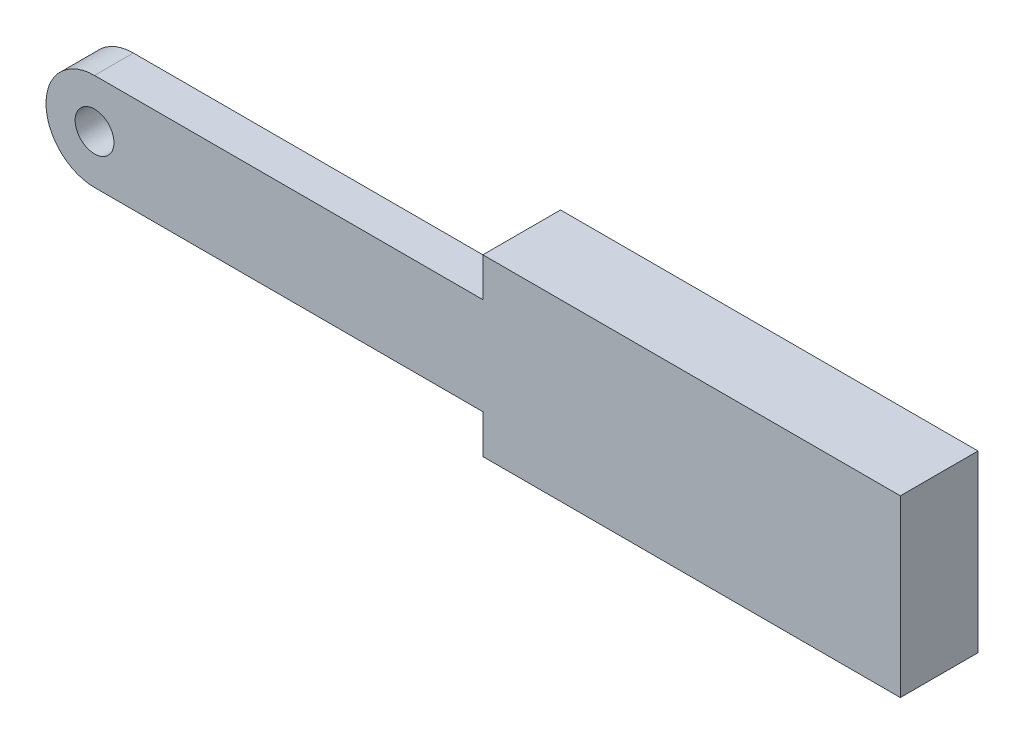
ISO-10303-21;
HEADER;
FILE_DESCRIPTION(('STEP AP214'),'2;1');
FILE_NAME('part.step','',(''),(''),'','','');
FILE_SCHEMA(('AUTOMOTIVE_DESIGN { 1 0 10303 214 1 1 1 1 }'));
ENDSEC;
DATA;
#1=APPLICATION_CONTEXT('core data for automotive mechanical design processes');
#2=APPLICATION_PROTOCOL_DEFINITION('international standard','automotive_design',2000,#1);
#3=PRODUCT_CONTEXT('',#1,'mechanical');
#4=PRODUCT('Part','Part','',(#3));
#5=PRODUCT_RELATED_PRODUCT_CATEGORY('part','',(#4));
#6=PRODUCT_DEFINITION_FORMATION('','',#4);
#7=PRODUCT_DEFINITION_CONTEXT('part definition',#1,'design');
#8=PRODUCT_DEFINITION('design','',#6,#7);
#9=PRODUCT_DEFINITION_SHAPE('','',#8);
#10=(LENGTH_UNIT() NAMED_UNIT(*) SI_UNIT(.MILLI.,.METRE.));
#11=(NAMED_UNIT(*) PLANE_ANGLE_UNIT() SI_UNIT($,.RADIAN.));
#12=(NAMED_UNIT(*) SI_UNIT($,.STERADIAN.) SOLID_ANGLE_UNIT());
#13=UNCERTAINTY_MEASURE_WITH_UNIT(LENGTH_MEASURE(1.E-05),#10,'distance_accuracy_value','');
#14=(GEOMETRIC_REPRESENTATION_CONTEXT(3) GLOBAL_UNCERTAINTY_ASSIGNED_CONTEXT((#13)) GLOBAL_UNIT_ASSIGNED_CONTEXT((#10,
#11,#12)) REPRESENTATION_CONTEXT('',''));
#15=CARTESIAN_POINT('',(0.,0.,0.));
#16=DIRECTION('',(0.,0.,1.));
#17=DIRECTION('',(1.,0.,0.));
#18=AXIS2_PLACEMENT_3D('',#15,#16,#17);
#19=CARTESIAN_POINT('',(0.,0.,0.));
#20=DIRECTION('',(0.,0.,1.));
#21=DIRECTION('',(1.,0.,0.));
#22=AXIS2_PLACEMENT_3D('',#19,#20,#21);
#23=PLANE('',#22);
#24=DIRECTION('',(1.,0.,0.));
#25=VECTOR('',#24,1.);
#26=CARTESIAN_POINT('',(0.,-9.,0.));
#27=LINE('',#26,#25);
#28=CARTESIAN_POINT('',(-21.5,-9.,0.));
#29=VERTEX_POINT('',#28);
#30=CARTESIAN_POINT('',(21.5,-9.,0.));
#31=VERTEX_POINT('',#30);
#32=EDGE_CURVE('E253',#29,#31,#27,.T.);
#33=ORIENTED_EDGE('',*,*,#32,.F.);
#34=DIRECTION('',(0.,1.,0.));
#35=VECTOR('',#34,1.);
#36=CARTESIAN_POINT('',(-21.5,0.,0.));
#37=LINE('',#36,#35);
#38=CARTESIAN_POINT('',(-21.5,9.,0.));
#39=VERTEX_POINT('',#38);
#40=EDGE_CURVE('E258',#29,#39,#37,.T.);
#41=ORIENTED_EDGE('',*,*,#40,.T.);
#42=DIRECTION('',(1.,0.,0.));
#43=VECTOR('',#42,1.);
#44=CARTESIAN_POINT('',(0.,9.,0.));
#45=LINE('',#44,#43);
#46=CARTESIAN_POINT('',(21.5,9.,0.));
#47=VERTEX_POINT('',#46);
#48=EDGE_CURVE('E273',#39,#47,#45,.T.);
#49=ORIENTED_EDGE('',*,*,#48,.T.);
#50=DIRECTION('',(0.,1.,0.));
#51=VECTOR('',#50,1.);
#52=CARTESIAN_POINT('',(21.5,0.,0.));
#53=LINE('',#52,#51);
#54=EDGE_CURVE('E270',#31,#47,#53,.T.);
#55=ORIENTED_EDGE('',*,*,#54,.F.);
#56=EDGE_LOOP('',(#33,#41,#49,#55));
#57=FACE_BOUND('',#56,.T.);
#58=CARTESIAN_POINT('',(0.,0.,0.));
#59=DIRECTION('',(0.,0.,1.));
#60=DIRECTION('',(1.,0.,0.));
#61=AXIS2_PLACEMENT_3D('',#58,#59,#60);
#62=CIRCLE('',#61,6.4);
#63=CARTESIAN_POINT('',(-4.51489762889421,-4.53604446633909,0.));
#64=VERTEX_POINT('',#63);
#65=CARTESIAN_POINT('',(4.51489762889421,-4.53604446633909,0.));
#66=VERTEX_POINT('',#65);
#67=EDGE_CURVE('E200',#64,#66,#62,.T.);
#68=ORIENTED_EDGE('',*,*,#67,.T.);
#69=DIRECTION('',(-0.989359135364853,-0.145493990494831,0.));
#70=VECTOR('',#69,1.);
#71=CARTESIAN_POINT('',(0.748518204911092,-5.08992379339543,0.));
#72=LINE('',#71,#70);
#73=CARTESIAN_POINT('',(17.,-2.7,0.));
#74=VERTEX_POINT('',#73);
#75=EDGE_CURVE('E62',#74,#66,#72,.T.);
#76=ORIENTED_EDGE('',*,*,#75,.F.);
#77=CARTESIAN_POINT('',(17.,0.,0.));
#78=DIRECTION('',(0.,0.,1.));
#79=DIRECTION('',(1.,0.,0.));
#80=AXIS2_PLACEMENT_3D('',#77,#78,#79);
#81=CIRCLE('',#80,2.7);
#82=CARTESIAN_POINT('',(17.,2.7,0.));
#83=VERTEX_POINT('',#82);
#84=EDGE_CURVE('E218',#83,#74,#81,.F.);
#85=ORIENTED_EDGE('',*,*,#84,.F.);
#86=DIRECTION('',(-0.989359135364853,0.145493990494831,0.));
#87=VECTOR('',#86,1.);
#88=CARTESIAN_POINT('',(0.748518204911092,5.08992379339543,0.));
#89=LINE('',#88,#87);
#90=CARTESIAN_POINT('',(4.51489762889421,4.53604446633909,0.));
#91=VERTEX_POINT('',#90);
#92=EDGE_CURVE('E221',#83,#91,#89,.T.);
#93=ORIENTED_EDGE('',*,*,#92,.T.);
#94=CARTESIAN_POINT('',(0.,0.,0.));
#95=DIRECTION('',(0.,0.,1.));
#96=DIRECTION('',(1.,0.,0.));
#97=AXIS2_PLACEMENT_3D('',#94,#95,#96);
#98=CIRCLE('',#97,6.4);
#99=CARTESIAN_POINT('',(-4.51489762889421,4.53604446633909,0.));
#100=VERTEX_POINT('',#99);
#101=EDGE_CURVE('E224',#91,#100,#98,.T.);
#102=ORIENTED_EDGE('',*,*,#101,.T.);
#103=DIRECTION('',(0.989359135364853,0.145493990494831,0.));
#104=VECTOR('',#103,1.);
#105=CARTESIAN_POINT('',(-0.748518204911092,5.08992379339543,0.));
#106=LINE('',#105,#104);
#107=CARTESIAN_POINT('',(-17.,2.7,0.));
#108=VERTEX_POINT('',#107);
#109=EDGE_CURVE('E227',#108,#100,#106,.T.);
#110=ORIENTED_EDGE('',*,*,#109,.F.);
#111=CARTESIAN_POINT('',(-17.,0.,0.));
#112=DIRECTION('',(0.,0.,1.));
#113=DIRECTION('',(1.,0.,0.));
#114=AXIS2_PLACEMENT_3D('',#111,#112,#113);
#115=CIRCLE('',#114,2.7);
#116=CARTESIAN_POINT('',(-17.,-2.7,0.));
#117=VERTEX_POINT('',#116);
#118=EDGE_CURVE('E230',#108,#117,#115,.T.);
#119=ORIENTED_EDGE('',*,*,#118,.T.);
#120=DIRECTION('',(0.989359135364853,-0.145493990494831,0.));
#121=VECTOR('',#120,1.);
#122=CARTESIAN_POINT('',(-0.748518204911092,-5.08992379339543,0.));
#123=LINE('',#122,#121);
#124=EDGE_CURVE('E233',#117,#64,#123,.T.);
#125=ORIENTED_EDGE('',*,*,#124,.T.);
#126=EDGE_LOOP('',(#68,#76,#85,#93,#102,#110,#119,#125));
#127=FACE_BOUND('',#126,.T.);
#128=ADVANCED_FACE('F39',(#57,#127),#23,.F.);
#129=CARTESIAN_POINT('',(0.,-9.,8.));
#130=DIRECTION('',(0.,1.,0.));
#131=DIRECTION('',(0.,0.,1.));
#132=AXIS2_PLACEMENT_3D('',#129,#130,#131);
#133=PLANE('',#132);
#134=ORIENTED_EDGE('',*,*,#32,.T.);
#135=DIRECTION('',(0.,0.,-1.));
#136=VECTOR('',#135,1.);
#137=CARTESIAN_POINT('',(21.5,-9.,8.));
#138=LINE('',#137,#136);
#139=CARTESIAN_POINT('',(21.5,-9.,8.));
#140=VERTEX_POINT('',#139);
#141=EDGE_CURVE('E11',#140,#31,#138,.T.);
#142=ORIENTED_EDGE('',*,*,#141,.F.);
#143=DIRECTION('',(1.,0.,0.));
#144=VECTOR('',#143,1.);
#145=CARTESIAN_POINT('',(0.,-9.,8.));
#146=LINE('',#145,#144);
#147=CARTESIAN_POINT('',(-21.5,-9.,8.));
#148=VERTEX_POINT('',#147);
#149=EDGE_CURVE('E254',#148,#140,#146,.T.);
#150=ORIENTED_EDGE('',*,*,#149,.F.);
#151=DIRECTION('',(0.,0.,-1.));
#152=VECTOR('',#151,1.);
#153=CARTESIAN_POINT('',(-21.5,-9.,8.));
#154=LINE('',#153,#152);
#155=EDGE_CURVE('E267',#148,#29,#154,.T.);
#156=ORIENTED_EDGE('',*,*,#155,.T.);
#157=EDGE_LOOP('',(#134,#142,#150,#156));
#158=FACE_BOUND('',#157,.T.);
#159=ADVANCED_FACE('F41',(#158),#133,.F.);
#160=CARTESIAN_POINT('',(21.5,0.,8.));
#161=DIRECTION('',(-1.,0.,0.));
#162=DIRECTION('',(0.,0.,1.));
#163=AXIS2_PLACEMENT_3D('',#160,#161,#162);
#164=PLANE('',#163);
#165=ORIENTED_EDGE('',*,*,#54,.T.);
#166=DIRECTION('',(0.,0.,-1.));
#167=VECTOR('',#166,1.);
#168=CARTESIAN_POINT('',(21.5,9.,8.));
#169=LINE('',#168,#167);
#170=CARTESIAN_POINT('',(21.5,9.,8.));
#171=VERTEX_POINT('',#170);
#172=EDGE_CURVE('E47',#171,#47,#169,.T.);
#173=ORIENTED_EDGE('',*,*,#172,.F.);
#174=DIRECTION('',(0.,1.,0.));
#175=VECTOR('',#174,1.);
#176=CARTESIAN_POINT('',(21.5,0.,8.));
#177=LINE('',#176,#175);
#178=EDGE_CURVE('E257',#140,#171,#177,.T.);
#179=ORIENTED_EDGE('',*,*,#178,.F.);
#180=ORIENTED_EDGE('',*,*,#141,.T.);
#181=EDGE_LOOP('',(#165,#173,#179,#180));
#182=FACE_BOUND('',#181,.T.);
#183=ADVANCED_FACE('F287',(#182),#164,.F.);
#184=CARTESIAN_POINT('',(0.,9.,8.));
#185=DIRECTION('',(0.,1.,0.));
#186=DIRECTION('',(0.,0.,1.));
#187=AXIS2_PLACEMENT_3D('',#184,#185,#186);
#188=PLANE('',#187);
#189=ORIENTED_EDGE('',*,*,#48,.F.);
#190=DIRECTION('',(0.,0.,-1.));
#191=VECTOR('',#190,1.);
#192=CARTESIAN_POINT('',(-21.5,9.,8.));
#193=LINE('',#192,#191);
#194=CARTESIAN_POINT('',(-21.5,9.,8.));
#195=VERTEX_POINT('',#194);
#196=EDGE_CURVE('E279',#195,#39,#193,.T.);
#197=ORIENTED_EDGE('',*,*,#196,.F.);
#198=DIRECTION('',(1.,0.,0.));
#199=VECTOR('',#198,1.);
#200=CARTESIAN_POINT('',(0.,9.,8.));
#201=LINE('',#200,#199);
#202=EDGE_CURVE('E260',#195,#171,#201,.T.);
#203=ORIENTED_EDGE('',*,*,#202,.T.);
#204=ORIENTED_EDGE('',*,*,#172,.T.);
#205=EDGE_LOOP('',(#189,#197,#203,#204));
#206=FACE_BOUND('',#205,.T.);
#207=ADVANCED_FACE('F283',(#206),#188,.T.);
#208=CARTESIAN_POINT('',(-21.5,0.,8.));
#209=DIRECTION('',(-1.,0.,0.));
#210=DIRECTION('',(0.,0.,1.));
#211=AXIS2_PLACEMENT_3D('',#208,#209,#210);
#212=PLANE('',#211);
#213=DIRECTION('',(0.,0.,1.));
#214=VECTOR('',#213,1.);
#215=CARTESIAN_POINT('',(-21.5,-5.,4.));
#216=LINE('',#215,#214);
#217=CARTESIAN_POINT('',(-21.5,-5.,4.));
#218=VERTEX_POINT('',#217);
#219=CARTESIAN_POINT('',(-21.5,-5.,8.));
#220=VERTEX_POINT('',#219);
#221=EDGE_CURVE('E173',#218,#220,#216,.T.);
#222=ORIENTED_EDGE('',*,*,#221,.F.);
#223=DIRECTION('',(0.,-1.,0.));
#224=VECTOR('',#223,1.);
#225=CARTESIAN_POINT('',(-21.5,0.,4.));
#226=LINE('',#225,#224);
#227=CARTESIAN_POINT('',(-21.5,5.,4.));
#228=VERTEX_POINT('',#227);
#229=EDGE_CURVE('E161',#228,#218,#226,.T.);
#230=ORIENTED_EDGE('',*,*,#229,.F.);
#231=DIRECTION('',(0.,0.,1.));
#232=VECTOR('',#231,1.);
#233=CARTESIAN_POINT('',(-21.5,5.,4.));
#234=LINE('',#233,#232);
#235=CARTESIAN_POINT('',(-21.5,5.,8.));
#236=VERTEX_POINT('',#235);
#237=EDGE_CURVE('E193',#228,#236,#234,.T.);
#238=ORIENTED_EDGE('',*,*,#237,.T.);
#239=DIRECTION('',(0.,1.,0.));
#240=VECTOR('',#239,1.);
#241=CARTESIAN_POINT('',(-21.5,0.,8.));
#242=LINE('',#241,#240);
#243=EDGE_CURVE('E263',#236,#195,#242,.T.);
#244=ORIENTED_EDGE('',*,*,#243,.T.);
#245=ORIENTED_EDGE('',*,*,#196,.T.);
#246=ORIENTED_EDGE('',*,*,#40,.F.);
#247=ORIENTED_EDGE('',*,*,#155,.F.);
#248=EDGE_CURVE('E264',#148,#220,#242,.T.);
#249=ORIENTED_EDGE('',*,*,#248,.T.);
#250=EDGE_LOOP('',(#222,#230,#238,#244,#245,#246,#247,#249));
#251=FACE_BOUND('',#250,.T.);
#252=ADVANCED_FACE('F294',(#251),#212,.T.);
#253=CARTESIAN_POINT('',(0.,0.,8.));
#254=DIRECTION('',(0.,0.,1.));
#255=DIRECTION('',(1.,0.,0.));
#256=AXIS2_PLACEMENT_3D('',#253,#254,#255);
#257=PLANE('',#256);
#258=ORIENTED_EDGE('',*,*,#149,.T.);
#259=ORIENTED_EDGE('',*,*,#178,.T.);
#260=ORIENTED_EDGE('',*,*,#202,.F.);
#261=ORIENTED_EDGE('',*,*,#243,.F.);
#262=DIRECTION('',(-1.,0.,0.));
#263=VECTOR('',#262,1.);
#264=CARTESIAN_POINT('',(0.,5.,8.));
#265=LINE('',#264,#263);
#266=CARTESIAN_POINT('',(-61.5,5.,8.));
#267=VERTEX_POINT('',#266);
#268=EDGE_CURVE('E54',#236,#267,#265,.T.);
#269=ORIENTED_EDGE('',*,*,#268,.T.);
#270=CARTESIAN_POINT('',(-61.5,0.,8.));
#271=DIRECTION('',(0.,0.,1.));
#272=DIRECTION('',(1.,0.,0.));
#273=AXIS2_PLACEMENT_3D('',#270,#271,#272);
#274=CIRCLE('',#273,5.);
#275=CARTESIAN_POINT('',(-61.5,-5.00000000000001,8.));
#276=VERTEX_POINT('',#275);
#277=EDGE_CURVE('E188',#267,#276,#274,.T.);
#278=ORIENTED_EDGE('',*,*,#277,.T.);
#279=DIRECTION('',(-1.,0.,0.));
#280=VECTOR('',#279,1.);
#281=CARTESIAN_POINT('',(0.,-5.,8.));
#282=LINE('',#281,#280);
#283=EDGE_CURVE('E169',#220,#276,#282,.T.);
#284=ORIENTED_EDGE('',*,*,#283,.F.);
#285=ORIENTED_EDGE('',*,*,#248,.F.);
#286=EDGE_LOOP('',(#258,#259,#260,#261,#269,#278,#284,#285));
#287=FACE_BOUND('',#286,.T.);
#288=CARTESIAN_POINT('',(-61.5,0.,8.));
#289=DIRECTION('',(0.,0.,1.));
#290=DIRECTION('',(1.,0.,0.));
#291=AXIS2_PLACEMENT_3D('',#288,#289,#290);
#292=CIRCLE('',#291,2.);
#293=CARTESIAN_POINT('',(-59.5,0.,8.));
#294=VERTEX_POINT('',#293);
#295=EDGE_CURVE('E185',#294,#294,#292,.T.);
#296=ORIENTED_EDGE('',*,*,#295,.F.);
#297=EDGE_LOOP('',(#296));
#298=FACE_BOUND('',#297,.T.);
#299=ADVANCED_FACE('F298',(#287,#298),#257,.T.);
#300=CARTESIAN_POINT('',(0.748518204911092,-5.08992379339543,2.3));
#301=DIRECTION('',(0.145493990494831,-0.989359135364853,0.));
#302=DIRECTION('',(0.989359135364853,0.145493990494831,0.));
#303=AXIS2_PLACEMENT_3D('',#300,#301,#302);
#304=PLANE('',#303);
#305=ORIENTED_EDGE('',*,*,#75,.T.);
#306=DIRECTION('',(0.,0.,-1.));
#307=VECTOR('',#306,1.);
#308=CARTESIAN_POINT('',(4.51489762889421,-4.53604446633909,2.3));
#309=LINE('',#308,#307);
#310=CARTESIAN_POINT('',(4.51489762889421,-4.53604446633909,2.3));
#311=VERTEX_POINT('',#310);
#312=EDGE_CURVE('E216',#311,#66,#309,.T.);
#313=ORIENTED_EDGE('',*,*,#312,.F.);
#314=DIRECTION('',(-0.989359135364853,-0.145493990494831,0.));
#315=VECTOR('',#314,1.);
#316=CARTESIAN_POINT('',(0.748518204911092,-5.08992379339543,2.3));
#317=LINE('',#316,#315);
#318=CARTESIAN_POINT('',(17.,-2.7,2.3));
#319=VERTEX_POINT('',#318);
#320=EDGE_CURVE('E196',#319,#311,#317,.T.);
#321=ORIENTED_EDGE('',*,*,#320,.F.);
#322=DIRECTION('',(0.,0.,-1.));
#323=VECTOR('',#322,1.);
#324=CARTESIAN_POINT('',(17.,-2.7,2.3));
#325=LINE('',#324,#323);
#326=EDGE_CURVE('E251',#319,#74,#325,.T.);
#327=ORIENTED_EDGE('',*,*,#326,.T.);
#328=EDGE_LOOP('',(#305,#313,#321,#327));
#329=FACE_BOUND('',#328,.T.);
#330=ADVANCED_FACE('F331',(#329),#304,.F.);
#331=CARTESIAN_POINT('',(17.,0.,2.3));
#332=DIRECTION('',(0.,0.,-1.));
#333=DIRECTION('',(-1.,0.,0.));
#334=AXIS2_PLACEMENT_3D('',#331,#332,#333);
#335=CYLINDRICAL_SURFACE('',#334,2.7);
#336=ORIENTED_EDGE('',*,*,#84,.T.);
#337=ORIENTED_EDGE('',*,*,#326,.F.);
#338=CARTESIAN_POINT('',(17.,0.,2.3));
#339=DIRECTION('',(0.,0.,1.));
#340=DIRECTION('',(1.,0.,0.));
#341=AXIS2_PLACEMENT_3D('',#338,#339,#340);
#342=CIRCLE('',#341,2.7);
#343=CARTESIAN_POINT('',(17.,2.7,2.3));
#344=VERTEX_POINT('',#343);
#345=EDGE_CURVE('E199',#344,#319,#342,.F.);
#346=ORIENTED_EDGE('',*,*,#345,.F.);
#347=DIRECTION('',(0.,0.,-1.));
#348=VECTOR('',#347,1.);
#349=CARTESIAN_POINT('',(17.,2.7,2.3));
#350=LINE('',#349,#348);
#351=EDGE_CURVE('E249',#344,#83,#350,.T.);
#352=ORIENTED_EDGE('',*,*,#351,.T.);
#353=EDGE_LOOP('',(#336,#337,#346,#352));
#354=FACE_BOUND('',#353,.T.);
#355=ADVANCED_FACE('F338',(#354),#335,.F.);
#356=CARTESIAN_POINT('',(0.748518204911092,5.08992379339543,2.3));
#357=DIRECTION('',(-0.145493990494831,-0.989359135364853,0.));
#358=DIRECTION('',(0.989359135364853,-0.145493990494831,0.));
#359=AXIS2_PLACEMENT_3D('',#356,#357,#358);
#360=PLANE('',#359);
#361=ORIENTED_EDGE('',*,*,#92,.F.);
#362=ORIENTED_EDGE('',*,*,#351,.F.);
#363=DIRECTION('',(-0.989359135364853,0.145493990494831,0.));
#364=VECTOR('',#363,1.);
#365=CARTESIAN_POINT('',(0.748518204911092,5.08992379339543,2.3));
#366=LINE('',#365,#364);
#367=CARTESIAN_POINT('',(4.51489762889421,4.53604446633909,2.3));
#368=VERTEX_POINT('',#367);
#369=EDGE_CURVE('E203',#344,#368,#366,.T.);
#370=ORIENTED_EDGE('',*,*,#369,.T.);
#371=DIRECTION('',(0.,0.,-1.));
#372=VECTOR('',#371,1.);
#373=CARTESIAN_POINT('',(4.51489762889421,4.53604446633909,2.3));
#374=LINE('',#373,#372);
#375=EDGE_CURVE('E247',#368,#91,#374,.T.);
#376=ORIENTED_EDGE('',*,*,#375,.T.);
#377=EDGE_LOOP('',(#361,#362,#370,#376));
#378=FACE_BOUND('',#377,.T.);
#379=ADVANCED_FACE('F344',(#378),#360,.T.);
#380=CARTESIAN_POINT('',(0.,0.,2.3));
#381=DIRECTION('',(0.,0.,-1.));
#382=DIRECTION('',(-1.,0.,0.));
#383=AXIS2_PLACEMENT_3D('',#380,#381,#382);
#384=CYLINDRICAL_SURFACE('',#383,6.4);
#385=ORIENTED_EDGE('',*,*,#101,.F.);
#386=ORIENTED_EDGE('',*,*,#375,.F.);
#387=CARTESIAN_POINT('',(0.,0.,2.3));
#388=DIRECTION('',(0.,0.,1.));
#389=DIRECTION('',(1.,0.,0.));
#390=AXIS2_PLACEMENT_3D('',#387,#388,#389);
#391=CIRCLE('',#390,6.4);
#392=CARTESIAN_POINT('',(-4.51489762889421,4.53604446633909,2.3));
#393=VERTEX_POINT('',#392);
#394=EDGE_CURVE('E205',#368,#393,#391,.T.);
#395=ORIENTED_EDGE('',*,*,#394,.T.);
#396=DIRECTION('',(0.,0.,-1.));
#397=VECTOR('',#396,1.);
#398=CARTESIAN_POINT('',(-4.51489762889421,4.53604446633909,2.3));
#399=LINE('',#398,#397);
#400=EDGE_CURVE('E245',#393,#100,#399,.T.);
#401=ORIENTED_EDGE('',*,*,#400,.T.);
#402=EDGE_LOOP('',(#385,#386,#395,#401));
#403=FACE_BOUND('',#402,.T.);
#404=ADVANCED_FACE('F352',(#403),#384,.F.);
#405=CARTESIAN_POINT('',(-0.748518204911092,5.08992379339543,2.3));
#406=DIRECTION('',(-0.145493990494831,0.989359135364853,0.));
#407=DIRECTION('',(-0.989359135364853,-0.145493990494831,0.));
#408=AXIS2_PLACEMENT_3D('',#405,#406,#407);
#409=PLANE('',#408);
#410=ORIENTED_EDGE('',*,*,#109,.T.);
#411=ORIENTED_EDGE('',*,*,#400,.F.);
#412=DIRECTION('',(0.989359135364853,0.145493990494831,0.));
#413=VECTOR('',#412,1.);
#414=CARTESIAN_POINT('',(-0.748518204911092,5.08992379339543,2.3));
#415=LINE('',#414,#413);
#416=CARTESIAN_POINT('',(-17.,2.7,2.3));
#417=VERTEX_POINT('',#416);
#418=EDGE_CURVE('E207',#417,#393,#415,.T.);
#419=ORIENTED_EDGE('',*,*,#418,.F.);
#420=DIRECTION('',(0.,0.,-1.));
#421=VECTOR('',#420,1.);
#422=CARTESIAN_POINT('',(-17.,2.7,2.3));
#423=LINE('',#422,#421);
#424=EDGE_CURVE('E243',#417,#108,#423,.T.);
#425=ORIENTED_EDGE('',*,*,#424,.T.);
#426=EDGE_LOOP('',(#410,#411,#419,#425));
#427=FACE_BOUND('',#426,.T.);
#428=ADVANCED_FACE('F360',(#427),#409,.F.);
#429=CARTESIAN_POINT('',(-17.,0.,2.3));
#430=DIRECTION('',(0.,0.,-1.));
#431=DIRECTION('',(-1.,0.,0.));
#432=AXIS2_PLACEMENT_3D('',#429,#430,#431);
#433=CYLINDRICAL_SURFACE('',#432,2.7);
#434=ORIENTED_EDGE('',*,*,#118,.F.);
#435=ORIENTED_EDGE('',*,*,#424,.F.);
#436=CARTESIAN_POINT('',(-17.,0.,2.3));
#437=DIRECTION('',(0.,0.,1.));
#438=DIRECTION('',(1.,0.,0.));
#439=AXIS2_PLACEMENT_3D('',#436,#437,#438);
#440=CIRCLE('',#439,2.7);
#441=CARTESIAN_POINT('',(-17.,-2.7,2.3));
#442=VERTEX_POINT('',#441);
#443=EDGE_CURVE('E210',#417,#442,#440,.T.);
#444=ORIENTED_EDGE('',*,*,#443,.T.);
#445=DIRECTION('',(0.,0.,-1.));
#446=VECTOR('',#445,1.);
#447=CARTESIAN_POINT('',(-17.,-2.7,2.3));
#448=LINE('',#447,#446);
#449=EDGE_CURVE('E241',#442,#117,#448,.T.);
#450=ORIENTED_EDGE('',*,*,#449,.T.);
#451=EDGE_LOOP('',(#434,#435,#444,#450));
#452=FACE_BOUND('',#451,.T.);
#453=ADVANCED_FACE('F368',(#452),#433,.F.);
#454=CARTESIAN_POINT('',(-0.748518204911092,-5.08992379339543,2.3));
#455=DIRECTION('',(0.145493990494831,0.989359135364853,0.));
#456=DIRECTION('',(-0.989359135364853,0.145493990494831,0.));
#457=AXIS2_PLACEMENT_3D('',#454,#455,#456);
#458=PLANE('',#457);
#459=ORIENTED_EDGE('',*,*,#124,.F.);
#460=ORIENTED_EDGE('',*,*,#449,.F.);
#461=DIRECTION('',(0.989359135364853,-0.145493990494831,0.));
#462=VECTOR('',#461,1.);
#463=CARTESIAN_POINT('',(-0.748518204911092,-5.08992379339543,2.3));
#464=LINE('',#463,#462);
#465=CARTESIAN_POINT('',(-4.51489762889421,-4.53604446633909,2.3));
#466=VERTEX_POINT('',#465);
#467=EDGE_CURVE('E212',#442,#466,#464,.T.);
#468=ORIENTED_EDGE('',*,*,#467,.T.);
#469=DIRECTION('',(0.,0.,-1.));
#470=VECTOR('',#469,1.);
#471=CARTESIAN_POINT('',(-4.51489762889421,-4.53604446633909,2.3));
#472=LINE('',#471,#470);
#473=EDGE_CURVE('E239',#466,#64,#472,.T.);
#474=ORIENTED_EDGE('',*,*,#473,.T.);
#475=EDGE_LOOP('',(#459,#460,#468,#474));
#476=FACE_BOUND('',#475,.T.);
#477=ADVANCED_FACE('F376',(#476),#458,.T.);
#478=CARTESIAN_POINT('',(0.,0.,2.3));
#479=DIRECTION('',(0.,0.,-1.));
#480=DIRECTION('',(-1.,0.,0.));
#481=AXIS2_PLACEMENT_3D('',#478,#479,#480);
#482=CYLINDRICAL_SURFACE('',#481,6.4);
#483=ORIENTED_EDGE('',*,*,#67,.F.);
#484=ORIENTED_EDGE('',*,*,#473,.F.);
#485=CARTESIAN_POINT('',(0.,0.,2.3));
#486=DIRECTION('',(0.,0.,1.));
#487=DIRECTION('',(1.,0.,0.));
#488=AXIS2_PLACEMENT_3D('',#485,#486,#487);
#489=CIRCLE('',#488,6.4);
#490=EDGE_CURVE('E214',#466,#311,#489,.T.);
#491=ORIENTED_EDGE('',*,*,#490,.T.);
#492=ORIENTED_EDGE('',*,*,#312,.T.);
#493=EDGE_LOOP('',(#483,#484,#491,#492));
#494=FACE_BOUND('',#493,.T.);
#495=ADVANCED_FACE('F384',(#494),#482,.F.);
#496=CARTESIAN_POINT('',(0.,0.,2.3));
#497=DIRECTION('',(0.,0.,1.));
#498=DIRECTION('',(1.,0.,0.));
#499=AXIS2_PLACEMENT_3D('',#496,#497,#498);
#500=PLANE('',#499);
#501=ORIENTED_EDGE('',*,*,#320,.T.);
#502=ORIENTED_EDGE('',*,*,#490,.F.);
#503=ORIENTED_EDGE('',*,*,#467,.F.);
#504=ORIENTED_EDGE('',*,*,#443,.F.);
#505=ORIENTED_EDGE('',*,*,#418,.T.);
#506=ORIENTED_EDGE('',*,*,#394,.F.);
#507=ORIENTED_EDGE('',*,*,#369,.F.);
#508=ORIENTED_EDGE('',*,*,#345,.T.);
#509=EDGE_LOOP('',(#501,#502,#503,#504,#505,#506,#507,#508));
#510=FACE_BOUND('',#509,.T.);
#511=ADVANCED_FACE('F392',(#510),#500,.F.);
#512=CARTESIAN_POINT('',(-61.5,0.,4.));
#513=DIRECTION('',(0.,0.,1.));
#514=DIRECTION('',(1.,0.,0.));
#515=AXIS2_PLACEMENT_3D('',#512,#513,#514);
#516=CYLINDRICAL_SURFACE('',#515,5.);
#517=ORIENTED_EDGE('',*,*,#277,.F.);
#518=DIRECTION('',(0.,0.,1.));
#519=VECTOR('',#518,1.);
#520=CARTESIAN_POINT('',(-61.5,5.,4.));
#521=LINE('',#520,#519);
#522=CARTESIAN_POINT('',(-61.5,5.,4.));
#523=VERTEX_POINT('',#522);
#524=EDGE_CURVE('E177',#523,#267,#521,.T.);
#525=ORIENTED_EDGE('',*,*,#524,.F.);
#526=CARTESIAN_POINT('',(-61.5,0.,4.));
#527=DIRECTION('',(0.,0.,1.));
#528=DIRECTION('',(1.,0.,0.));
#529=AXIS2_PLACEMENT_3D('',#526,#527,#528);
#530=CIRCLE('',#529,5.);
#531=CARTESIAN_POINT('',(-61.5,-5.00000000000001,4.));
#532=VERTEX_POINT('',#531);
#533=EDGE_CURVE('E158',#523,#532,#530,.T.);
#534=ORIENTED_EDGE('',*,*,#533,.T.);
#535=DIRECTION('',(0.,0.,1.));
#536=VECTOR('',#535,1.);
#537=CARTESIAN_POINT('',(-61.5,-5.00000000000001,4.));
#538=LINE('',#537,#536);
#539=EDGE_CURVE('E167',#532,#276,#538,.T.);
#540=ORIENTED_EDGE('',*,*,#539,.T.);
#541=EDGE_LOOP('',(#517,#525,#534,#540));
#542=FACE_BOUND('',#541,.T.);
#543=ADVANCED_FACE('F176',(#542),#516,.T.);
#544=CARTESIAN_POINT('',(0.,5.,4.));
#545=DIRECTION('',(0.,1.,0.));
#546=DIRECTION('',(-1.,0.,0.));
#547=AXIS2_PLACEMENT_3D('',#544,#545,#546);
#548=PLANE('',#547);
#549=ORIENTED_EDGE('',*,*,#268,.F.);
#550=ORIENTED_EDGE('',*,*,#237,.F.);
#551=DIRECTION('',(-1.,0.,0.));
#552=VECTOR('',#551,1.);
#553=CARTESIAN_POINT('',(0.,5.,4.));
#554=LINE('',#553,#552);
#555=EDGE_CURVE('E174',#228,#523,#554,.T.);
#556=ORIENTED_EDGE('',*,*,#555,.T.);
#557=ORIENTED_EDGE('',*,*,#524,.T.);
#558=EDGE_LOOP('',(#549,#550,#556,#557));
#559=FACE_BOUND('',#558,.T.);
#560=ADVANCED_FACE('F405',(#559),#548,.T.);
#561=CARTESIAN_POINT('',(-61.5,0.,4.));
#562=DIRECTION('',(0.,0.,1.));
#563=DIRECTION('',(1.,0.,0.));
#564=AXIS2_PLACEMENT_3D('',#561,#562,#563);
#565=CYLINDRICAL_SURFACE('',#564,2.);
#566=CARTESIAN_POINT('',(-61.5,0.,4.));
#567=DIRECTION('',(0.,0.,1.));
#568=DIRECTION('',(1.,0.,0.));
#569=AXIS2_PLACEMENT_3D('',#566,#567,#568);
#570=CIRCLE('',#569,2.);
#571=CARTESIAN_POINT('',(-59.5,0.,4.));
#572=VERTEX_POINT('',#571);
#573=EDGE_CURVE('E178',#572,#572,#570,.T.);
#574=ORIENTED_EDGE('',*,*,#573,.F.);
#575=EDGE_LOOP('',(#574));
#576=FACE_BOUND('',#575,.T.);
#577=ORIENTED_EDGE('',*,*,#295,.T.);
#578=EDGE_LOOP('',(#577));
#579=FACE_BOUND('',#578,.T.);
#580=ADVANCED_FACE('F412',(#576,#579),#565,.F.);
#581=CARTESIAN_POINT('',(0.,-5.,4.));
#582=DIRECTION('',(0.,1.,0.));
#583=DIRECTION('',(-1.,0.,0.));
#584=AXIS2_PLACEMENT_3D('',#581,#582,#583);
#585=PLANE('',#584);
#586=ORIENTED_EDGE('',*,*,#283,.T.);
#587=ORIENTED_EDGE('',*,*,#539,.F.);
#588=DIRECTION('',(-1.,0.,0.));
#589=VECTOR('',#588,1.);
#590=CARTESIAN_POINT('',(0.,-5.,4.));
#591=LINE('',#590,#589);
#592=EDGE_CURVE('E153',#218,#532,#591,.T.);
#593=ORIENTED_EDGE('',*,*,#592,.F.);
#594=ORIENTED_EDGE('',*,*,#221,.T.);
#595=EDGE_LOOP('',(#586,#587,#593,#594));
#596=FACE_BOUND('',#595,.T.);
#597=ADVANCED_FACE('F168',(#596),#585,.F.);
#598=CARTESIAN_POINT('',(0.,0.,4.));
#599=DIRECTION('',(0.,0.,1.));
#600=DIRECTION('',(1.,0.,0.));
#601=AXIS2_PLACEMENT_3D('',#598,#599,#600);
#602=PLANE('',#601);
#603=ORIENTED_EDGE('',*,*,#573,.T.);
#604=EDGE_LOOP('',(#603));
#605=FACE_BOUND('',#604,.T.);
#606=ORIENTED_EDGE('',*,*,#533,.F.);
#607=ORIENTED_EDGE('',*,*,#555,.F.);
#608=ORIENTED_EDGE('',*,*,#229,.T.);
#609=ORIENTED_EDGE('',*,*,#592,.T.);
#610=EDGE_LOOP('',(#606,#607,#608,#609));
#611=FACE_BOUND('',#610,.T.);
#612=ADVANCED_FACE('F155',(#605,#611),#602,.F.);
#613=CLOSED_SHELL('',(#128,#159,#183,#207,#252,#299,#330,#355,#379,#404,#428,#453,#477,#495,
#511,#543,#560,#580,#597,#612));
#614=MANIFOLD_SOLID_BREP('B2',#613);
#615=ADVANCED_BREP_SHAPE_REPRESENTATION('',(#18,#614),#14);
#616=SHAPE_DEFINITION_REPRESENTATION(#9,#615);
ENDSEC;
END-ISO-10303-21;
